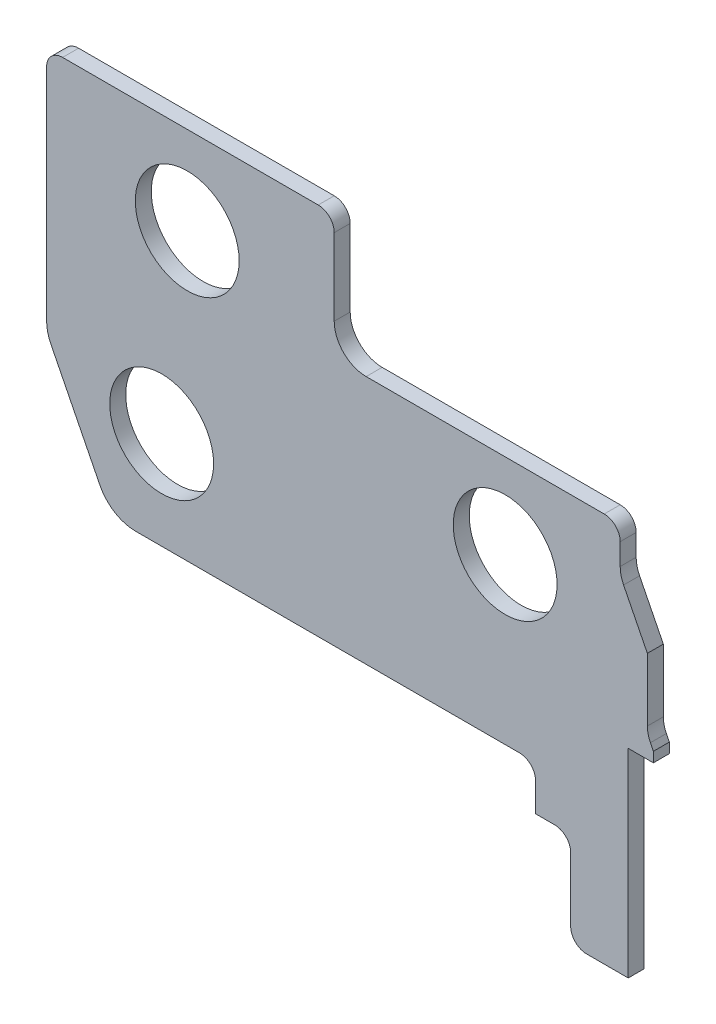
ISO-10303-21;
HEADER;
FILE_DESCRIPTION(('STEP AP214'),'2;1');
FILE_NAME('part.step','',(''),(''),'','','');
FILE_SCHEMA(('AUTOMOTIVE_DESIGN { 1 0 10303 214 1 1 1 1 }'));
ENDSEC;
DATA;
#1=APPLICATION_CONTEXT('core data for automotive mechanical design processes');
#2=APPLICATION_PROTOCOL_DEFINITION('international standard','automotive_design',2000,#1);
#3=PRODUCT_CONTEXT('',#1,'mechanical');
#4=PRODUCT('Part','Part','',(#3));
#5=PRODUCT_RELATED_PRODUCT_CATEGORY('part','',(#4));
#6=PRODUCT_DEFINITION_FORMATION('','',#4);
#7=PRODUCT_DEFINITION_CONTEXT('part definition',#1,'design');
#8=PRODUCT_DEFINITION('design','',#6,#7);
#9=PRODUCT_DEFINITION_SHAPE('','',#8);
#10=(LENGTH_UNIT() NAMED_UNIT(*) SI_UNIT(.MILLI.,.METRE.));
#11=(NAMED_UNIT(*) PLANE_ANGLE_UNIT() SI_UNIT($,.RADIAN.));
#12=(NAMED_UNIT(*) SI_UNIT($,.STERADIAN.) SOLID_ANGLE_UNIT());
#13=UNCERTAINTY_MEASURE_WITH_UNIT(LENGTH_MEASURE(1.E-05),#10,'distance_accuracy_value','');
#14=(GEOMETRIC_REPRESENTATION_CONTEXT(3) GLOBAL_UNCERTAINTY_ASSIGNED_CONTEXT((#13)) GLOBAL_UNIT_ASSIGNED_CONTEXT((#10,
#11,#12)) REPRESENTATION_CONTEXT('',''));
#15=CARTESIAN_POINT('',(0.,0.,0.));
#16=DIRECTION('',(0.,0.,1.));
#17=DIRECTION('',(1.,0.,0.));
#18=AXIS2_PLACEMENT_3D('',#15,#16,#17);
#19=CARTESIAN_POINT('',(-75.7031674369768,240.042852562914,1.));
#20=DIRECTION('',(0.,0.,1.));
#21=DIRECTION('',(1.,0.,0.));
#22=AXIS2_PLACEMENT_3D('',#19,#20,#21);
#23=PLANE('',#22);
#24=CARTESIAN_POINT('',(-86.4031674369768,244.887318465559,1.));
#25=DIRECTION('',(0.,0.,1.));
#26=DIRECTION('',(1.,0.,0.));
#27=AXIS2_PLACEMENT_3D('',#24,#25,#26);
#28=CIRCLE('',#27,3.24999999999999);
#29=CARTESIAN_POINT('',(-83.1531674369768,244.887318465559,1.));
#30=VERTEX_POINT('',#29);
#31=EDGE_CURVE('E587',#30,#30,#28,.T.);
#32=ORIENTED_EDGE('',*,*,#31,.F.);
#33=EDGE_LOOP('',(#32));
#34=FACE_BOUND('',#33,.T.);
#35=CARTESIAN_POINT('',(-75.7031674369768,240.042852562914,1.));
#36=DIRECTION('',(0.,0.,-1.));
#37=DIRECTION('',(1.,0.,0.));
#38=AXIS2_PLACEMENT_3D('',#35,#36,#37);
#39=CIRCLE('',#38,1.8);
#40=CARTESIAN_POINT('',(-77.3116780752747,239.234958060839,1.));
#41=VERTEX_POINT('',#40);
#42=CARTESIAN_POINT('',(-77.5031674369768,240.042852562914,1.));
#43=VERTEX_POINT('',#42);
#44=EDGE_CURVE('E348',#41,#43,#39,.T.);
#45=ORIENTED_EDGE('',*,*,#44,.T.);
#46=DIRECTION('',(0.,1.,0.));
#47=VECTOR('',#46,1.);
#48=CARTESIAN_POINT('',(-77.5031674369768,240.042852562914,1.));
#49=LINE('',#48,#47);
#50=CARTESIAN_POINT('',(-77.5031674369768,243.984122492954,1.));
#51=VERTEX_POINT('',#50);
#52=EDGE_CURVE('E164',#43,#51,#49,.T.);
#53=ORIENTED_EDGE('',*,*,#52,.T.);
#54=DIRECTION('',(-0.448830278930408,0.893617021276594,0.));
#55=VECTOR('',#54,1.);
#56=CARTESIAN_POINT('',(-77.5031674369768,243.984122492954,1.));
#57=LINE('',#56,#55);
#58=CARTESIAN_POINT('',(-78.99040147953,246.945192005053,1.));
#59=VERTEX_POINT('',#58);
#60=EDGE_CURVE('E449',#51,#59,#57,.T.);
#61=ORIENTED_EDGE('',*,*,#60,.T.);
#62=CARTESIAN_POINT('',(-77.2031674369768,247.842852562914,1.));
#63=DIRECTION('',(0.,0.,-1.));
#64=DIRECTION('',(1.,0.,0.));
#65=AXIS2_PLACEMENT_3D('',#62,#63,#64);
#66=CIRCLE('',#65,2.);
#67=CARTESIAN_POINT('',(-79.2031674369768,247.842852562914,1.));
#68=VERTEX_POINT('',#67);
#69=EDGE_CURVE('E469',#59,#68,#66,.T.);
#70=ORIENTED_EDGE('',*,*,#69,.T.);
#71=DIRECTION('',(0.,1.,0.));
#72=VECTOR('',#71,1.);
#73=CARTESIAN_POINT('',(-79.2031674369768,247.842852562914,1.));
#74=LINE('',#73,#72);
#75=CARTESIAN_POINT('',(-79.2031674369768,249.187318465559,1.));
#76=VERTEX_POINT('',#75);
#77=EDGE_CURVE('E465',#68,#76,#74,.T.);
#78=ORIENTED_EDGE('',*,*,#77,.T.);
#79=CARTESIAN_POINT('',(-80.2031674369768,249.187318465559,1.));
#80=DIRECTION('',(0.,0.,1.));
#81=DIRECTION('',(1.,0.,0.));
#82=AXIS2_PLACEMENT_3D('',#79,#80,#81);
#83=CIRCLE('',#82,1.);
#84=CARTESIAN_POINT('',(-80.2031674369768,250.187318465559,1.));
#85=VERTEX_POINT('',#84);
#86=EDGE_CURVE('E468',#76,#85,#83,.T.);
#87=ORIENTED_EDGE('',*,*,#86,.T.);
#88=DIRECTION('',(-1.,0.,0.));
#89=VECTOR('',#88,1.);
#90=CARTESIAN_POINT('',(-80.2031674369768,250.187318465559,1.));
#91=LINE('',#90,#89);
#92=CARTESIAN_POINT('',(-95.1031674369768,250.187318465559,1.));
#93=VERTEX_POINT('',#92);
#94=EDGE_CURVE('E473',#85,#93,#91,.T.);
#95=ORIENTED_EDGE('',*,*,#94,.T.);
#96=CARTESIAN_POINT('',(-95.1031674369768,252.187318465559,1.));
#97=DIRECTION('',(0.,0.,-1.));
#98=DIRECTION('',(1.,0.,0.));
#99=AXIS2_PLACEMENT_3D('',#96,#97,#98);
#100=CIRCLE('',#99,2.);
#101=CARTESIAN_POINT('',(-97.1031674369768,252.187318465559,1.));
#102=VERTEX_POINT('',#101);
#103=EDGE_CURVE('E480',#93,#102,#100,.T.);
#104=ORIENTED_EDGE('',*,*,#103,.T.);
#105=DIRECTION('',(0.,1.,0.));
#106=VECTOR('',#105,1.);
#107=CARTESIAN_POINT('',(-97.1031674369768,252.187318465559,1.));
#108=LINE('',#107,#106);
#109=CARTESIAN_POINT('',(-97.1031674369768,256.987318465559,1.));
#110=VERTEX_POINT('',#109);
#111=EDGE_CURVE('E483',#102,#110,#108,.T.);
#112=ORIENTED_EDGE('',*,*,#111,.T.);
#113=CARTESIAN_POINT('',(-98.1031674369768,256.987318465559,1.));
#114=DIRECTION('',(0.,0.,1.));
#115=DIRECTION('',(1.,0.,0.));
#116=AXIS2_PLACEMENT_3D('',#113,#114,#115);
#117=CIRCLE('',#116,1.);
#118=CARTESIAN_POINT('',(-98.1031674369768,257.987318465559,1.));
#119=VERTEX_POINT('',#118);
#120=EDGE_CURVE('E486',#110,#119,#117,.T.);
#121=ORIENTED_EDGE('',*,*,#120,.T.);
#122=DIRECTION('',(-1.,0.,0.));
#123=VECTOR('',#122,1.);
#124=CARTESIAN_POINT('',(-98.1031674369768,257.987318465559,1.));
#125=LINE('',#124,#123);
#126=CARTESIAN_POINT('',(-114.103167436977,257.987318465559,1.));
#127=VERTEX_POINT('',#126);
#128=EDGE_CURVE('E489',#119,#127,#125,.T.);
#129=ORIENTED_EDGE('',*,*,#128,.T.);
#130=CARTESIAN_POINT('',(-114.103167436977,256.987318465559,1.));
#131=DIRECTION('',(0.,0.,1.));
#132=DIRECTION('',(1.,0.,0.));
#133=AXIS2_PLACEMENT_3D('',#130,#131,#132);
#134=CIRCLE('',#133,1.);
#135=CARTESIAN_POINT('',(-115.103167436977,256.987318465559,1.));
#136=VERTEX_POINT('',#135);
#137=EDGE_CURVE('E492',#127,#136,#134,.T.);
#138=ORIENTED_EDGE('',*,*,#137,.T.);
#139=DIRECTION('',(0.,-1.,0.));
#140=VECTOR('',#139,1.);
#141=CARTESIAN_POINT('',(-115.103167436977,256.987318465559,1.));
#142=LINE('',#141,#140);
#143=CARTESIAN_POINT('',(-115.103167436977,243.198386660269,1.));
#144=VERTEX_POINT('',#143);
#145=EDGE_CURVE('E495',#136,#144,#142,.T.);
#146=ORIENTED_EDGE('',*,*,#145,.T.);
#147=CARTESIAN_POINT('',(-112.603167436977,243.198386660269,1.));
#148=DIRECTION('',(0.,0.,1.));
#149=DIRECTION('',(1.,0.,0.));
#150=AXIS2_PLACEMENT_3D('',#147,#148,#149);
#151=CIRCLE('',#150,2.5);
#152=CARTESIAN_POINT('',(-114.837209990168,242.076310962943,1.));
#153=VERTEX_POINT('',#152);
#154=EDGE_CURVE('E498',#144,#153,#151,.T.);
#155=ORIENTED_EDGE('',*,*,#154,.T.);
#156=DIRECTION('',(0.448830278930403,-0.893617021276596,0.));
#157=VECTOR('',#156,1.);
#158=CARTESIAN_POINT('',(-114.837209990168,242.076310962943,1.));
#159=LINE('',#158,#157);
#160=CARTESIAN_POINT('',(-111.76784987606,235.965242768233,1.));
#161=VERTEX_POINT('',#160);
#162=EDGE_CURVE('E501',#153,#161,#159,.T.);
#163=ORIENTED_EDGE('',*,*,#162,.T.);
#164=CARTESIAN_POINT('',(-109.533807322869,237.087318465559,1.));
#165=DIRECTION('',(0.,0.,1.));
#166=DIRECTION('',(1.,0.,0.));
#167=AXIS2_PLACEMENT_3D('',#164,#165,#166);
#168=CIRCLE('',#167,2.5);
#169=CARTESIAN_POINT('',(-109.533807322869,234.587318465559,1.));
#170=VERTEX_POINT('',#169);
#171=EDGE_CURVE('E504',#161,#170,#168,.T.);
#172=ORIENTED_EDGE('',*,*,#171,.T.);
#173=DIRECTION('',(1.,0.,0.));
#174=VECTOR('',#173,1.);
#175=CARTESIAN_POINT('',(-109.533807322869,234.587318465559,1.));
#176=LINE('',#175,#174);
#177=CARTESIAN_POINT('',(-85.5031674369768,234.587318465559,1.));
#178=VERTEX_POINT('',#177);
#179=EDGE_CURVE('E507',#170,#178,#176,.T.);
#180=ORIENTED_EDGE('',*,*,#179,.T.);
#181=CARTESIAN_POINT('',(-85.5031674369768,233.587318465559,1.));
#182=DIRECTION('',(0.,0.,-1.));
#183=DIRECTION('',(1.,0.,0.));
#184=AXIS2_PLACEMENT_3D('',#181,#182,#183);
#185=CIRCLE('',#184,1.);
#186=CARTESIAN_POINT('',(-84.5031674369768,233.587318465559,1.));
#187=VERTEX_POINT('',#186);
#188=EDGE_CURVE('E510',#178,#187,#185,.T.);
#189=ORIENTED_EDGE('',*,*,#188,.T.);
#190=DIRECTION('',(0.,-1.,0.));
#191=VECTOR('',#190,1.);
#192=CARTESIAN_POINT('',(-84.5031674369768,233.587318465559,1.));
#193=LINE('',#192,#191);
#194=CARTESIAN_POINT('',(-84.5031674369768,231.787318465559,1.));
#195=VERTEX_POINT('',#194);
#196=EDGE_CURVE('E513',#187,#195,#193,.T.);
#197=ORIENTED_EDGE('',*,*,#196,.T.);
#198=DIRECTION('',(1.,0.,0.));
#199=VECTOR('',#198,1.);
#200=CARTESIAN_POINT('',(-84.5031674369768,231.787318465559,1.));
#201=LINE('',#200,#199);
#202=CARTESIAN_POINT('',(-83.3031674369768,231.787318465559,1.));
#203=VERTEX_POINT('',#202);
#204=EDGE_CURVE('E516',#195,#203,#201,.T.);
#205=ORIENTED_EDGE('',*,*,#204,.T.);
#206=CARTESIAN_POINT('',(-83.3031674369768,230.787318465559,1.));
#207=DIRECTION('',(0.,0.,-1.));
#208=DIRECTION('',(1.,0.,0.));
#209=AXIS2_PLACEMENT_3D('',#206,#207,#208);
#210=CIRCLE('',#209,1.);
#211=CARTESIAN_POINT('',(-82.3031674369768,230.787318465559,1.));
#212=VERTEX_POINT('',#211);
#213=EDGE_CURVE('E519',#203,#212,#210,.T.);
#214=ORIENTED_EDGE('',*,*,#213,.T.);
#215=DIRECTION('',(0.,-1.,0.));
#216=VECTOR('',#215,1.);
#217=CARTESIAN_POINT('',(-82.3031674369768,230.787318465559,1.));
#218=LINE('',#217,#216);
#219=CARTESIAN_POINT('',(-82.3031674369768,226.787318465559,1.));
#220=VERTEX_POINT('',#219);
#221=EDGE_CURVE('E522',#212,#220,#218,.T.);
#222=ORIENTED_EDGE('',*,*,#221,.T.);
#223=CARTESIAN_POINT('',(-81.3031674369768,226.787318465559,1.));
#224=DIRECTION('',(0.,0.,1.));
#225=DIRECTION('',(1.,0.,0.));
#226=AXIS2_PLACEMENT_3D('',#223,#224,#225);
#227=CIRCLE('',#226,1.);
#228=CARTESIAN_POINT('',(-81.3031674369768,225.787318465559,1.));
#229=VERTEX_POINT('',#228);
#230=EDGE_CURVE('E525',#220,#229,#227,.T.);
#231=ORIENTED_EDGE('',*,*,#230,.T.);
#232=DIRECTION('',(1.,0.,0.));
#233=VECTOR('',#232,1.);
#234=CARTESIAN_POINT('',(-81.3031674369768,225.787318465559,1.));
#235=LINE('',#234,#233);
#236=CARTESIAN_POINT('',(-78.6999999999858,225.787318465559,1.));
#237=VERTEX_POINT('',#236);
#238=EDGE_CURVE('E528',#229,#237,#235,.T.);
#239=ORIENTED_EDGE('',*,*,#238,.T.);
#240=DIRECTION('',(0.,1.,0.));
#241=VECTOR('',#240,1.);
#242=CARTESIAN_POINT('',(-78.6999999999858,225.787318465559,1.));
#243=LINE('',#242,#241);
#244=CARTESIAN_POINT('',(-78.6999999999858,238.236297681887,1.));
#245=VERTEX_POINT('',#244);
#246=EDGE_CURVE('E243',#237,#245,#243,.T.);
#247=ORIENTED_EDGE('',*,*,#246,.T.);
#248=DIRECTION('',(1.,0.,0.));
#249=VECTOR('',#248,1.);
#250=CARTESIAN_POINT('',(-78.6999999999858,238.236297681887,1.));
#251=LINE('',#250,#249);
#252=CARTESIAN_POINT('',(-77.1252272914991,238.236297681887,1.));
#253=VERTEX_POINT('',#252);
#254=EDGE_CURVE('E237',#245,#253,#251,.T.);
#255=ORIENTED_EDGE('',*,*,#254,.T.);
#256=DIRECTION('',(0.,1.,0.));
#257=VECTOR('',#256,1.);
#258=CARTESIAN_POINT('',(-77.1252272914991,238.236297681887,1.));
#259=LINE('',#258,#257);
#260=CARTESIAN_POINT('',(-77.1252272914991,238.863736238619,1.));
#261=VERTEX_POINT('',#260);
#262=EDGE_CURVE('E241',#253,#261,#259,.T.);
#263=ORIENTED_EDGE('',*,*,#262,.T.);
#264=DIRECTION('',(-0.448830278930413,0.893617021276591,0.));
#265=VECTOR('',#264,1.);
#266=CARTESIAN_POINT('',(-77.1252272914991,238.863736238619,1.));
#267=LINE('',#266,#265);
#268=EDGE_CURVE('E61',#261,#41,#267,.T.);
#269=ORIENTED_EDGE('',*,*,#268,.T.);
#270=EDGE_LOOP('',(#45,#53,#61,#70,#78,#87,#95,#104,#112,#121,#129,#138,#146,#155,#163,#172,
#180,#189,#197,#205,#214,#222,#231,#239,#247,#255,#263,#269));
#271=FACE_BOUND('',#270,.T.);
#272=CARTESIAN_POINT('',(-107.903167436977,240.687318465559,1.));
#273=DIRECTION('',(0.,0.,1.));
#274=DIRECTION('',(1.,0.,0.));
#275=AXIS2_PLACEMENT_3D('',#272,#273,#274);
#276=CIRCLE('',#275,3.25000000000001);
#277=CARTESIAN_POINT('',(-104.653167436977,240.687318465559,1.));
#278=VERTEX_POINT('',#277);
#279=EDGE_CURVE('E270',#278,#278,#276,.T.);
#280=ORIENTED_EDGE('',*,*,#279,.F.);
#281=EDGE_LOOP('',(#280));
#282=FACE_BOUND('',#281,.T.);
#283=CARTESIAN_POINT('',(-106.303167436977,252.487318465559,1.));
#284=DIRECTION('',(0.,0.,1.));
#285=DIRECTION('',(1.,0.,0.));
#286=AXIS2_PLACEMENT_3D('',#283,#284,#285);
#287=CIRCLE('',#286,3.24999999999999);
#288=CARTESIAN_POINT('',(-103.053167436977,252.487318465559,1.));
#289=VERTEX_POINT('',#288);
#290=EDGE_CURVE('E576',#289,#289,#287,.T.);
#291=ORIENTED_EDGE('',*,*,#290,.F.);
#292=EDGE_LOOP('',(#291));
#293=FACE_BOUND('',#292,.T.);
#294=ADVANCED_FACE('F43',(#34,#271,#282,#293),#23,.T.);
#295=CARTESIAN_POINT('',(-75.7031674369768,240.042852562914,0.));
#296=DIRECTION('',(0.,0.,1.));
#297=DIRECTION('',(1.,0.,0.));
#298=AXIS2_PLACEMENT_3D('',#295,#296,#297);
#299=PLANE('',#298);
#300=CARTESIAN_POINT('',(-75.7031674369768,240.042852562914,0.));
#301=DIRECTION('',(0.,0.,-1.));
#302=DIRECTION('',(1.,0.,0.));
#303=AXIS2_PLACEMENT_3D('',#300,#301,#302);
#304=CIRCLE('',#303,1.8);
#305=CARTESIAN_POINT('',(-77.3116780752747,239.234958060839,0.));
#306=VERTEX_POINT('',#305);
#307=CARTESIAN_POINT('',(-77.5031674369768,240.042852562914,0.));
#308=VERTEX_POINT('',#307);
#309=EDGE_CURVE('E265',#306,#308,#304,.T.);
#310=ORIENTED_EDGE('',*,*,#309,.F.);
#311=DIRECTION('',(-0.448830278930413,0.893617021276591,0.));
#312=VECTOR('',#311,1.);
#313=CARTESIAN_POINT('',(-77.1252272914991,238.863736238619,0.));
#314=LINE('',#313,#312);
#315=CARTESIAN_POINT('',(-77.1252272914991,238.863736238619,0.));
#316=VERTEX_POINT('',#315);
#317=EDGE_CURVE('E156',#316,#306,#314,.T.);
#318=ORIENTED_EDGE('',*,*,#317,.F.);
#319=DIRECTION('',(0.,1.,0.));
#320=VECTOR('',#319,1.);
#321=CARTESIAN_POINT('',(-77.1252272914991,238.236297681887,0.));
#322=LINE('',#321,#320);
#323=CARTESIAN_POINT('',(-77.1252272914991,238.236297681887,0.));
#324=VERTEX_POINT('',#323);
#325=EDGE_CURVE('E150',#324,#316,#322,.T.);
#326=ORIENTED_EDGE('',*,*,#325,.F.);
#327=DIRECTION('',(1.,0.,0.));
#328=VECTOR('',#327,1.);
#329=CARTESIAN_POINT('',(-78.6999999999858,238.236297681887,0.));
#330=LINE('',#329,#328);
#331=CARTESIAN_POINT('',(-78.6999999999858,238.236297681887,0.));
#332=VERTEX_POINT('',#331);
#333=EDGE_CURVE('E252',#332,#324,#330,.T.);
#334=ORIENTED_EDGE('',*,*,#333,.F.);
#335=DIRECTION('',(0.,1.,0.));
#336=VECTOR('',#335,1.);
#337=CARTESIAN_POINT('',(-78.6999999999858,225.787318465559,0.));
#338=LINE('',#337,#336);
#339=CARTESIAN_POINT('',(-78.6999999999858,225.787318465559,0.));
#340=VERTEX_POINT('',#339);
#341=EDGE_CURVE('E339',#340,#332,#338,.T.);
#342=ORIENTED_EDGE('',*,*,#341,.F.);
#343=DIRECTION('',(1.,0.,0.));
#344=VECTOR('',#343,1.);
#345=CARTESIAN_POINT('',(-81.3031674369768,225.787318465559,0.));
#346=LINE('',#345,#344);
#347=CARTESIAN_POINT('',(-81.3031674369768,225.787318465559,0.));
#348=VERTEX_POINT('',#347);
#349=EDGE_CURVE('E336',#348,#340,#346,.T.);
#350=ORIENTED_EDGE('',*,*,#349,.F.);
#351=CARTESIAN_POINT('',(-81.3031674369768,226.787318465559,0.));
#352=DIRECTION('',(0.,0.,1.));
#353=DIRECTION('',(1.,0.,0.));
#354=AXIS2_PLACEMENT_3D('',#351,#352,#353);
#355=CIRCLE('',#354,1.);
#356=CARTESIAN_POINT('',(-82.3031674369768,226.787318465559,0.));
#357=VERTEX_POINT('',#356);
#358=EDGE_CURVE('E333',#357,#348,#355,.T.);
#359=ORIENTED_EDGE('',*,*,#358,.F.);
#360=DIRECTION('',(0.,-1.,0.));
#361=VECTOR('',#360,1.);
#362=CARTESIAN_POINT('',(-82.3031674369768,230.787318465559,0.));
#363=LINE('',#362,#361);
#364=CARTESIAN_POINT('',(-82.3031674369768,230.787318465559,0.));
#365=VERTEX_POINT('',#364);
#366=EDGE_CURVE('E330',#365,#357,#363,.T.);
#367=ORIENTED_EDGE('',*,*,#366,.F.);
#368=CARTESIAN_POINT('',(-83.3031674369768,230.787318465559,0.));
#369=DIRECTION('',(0.,0.,-1.));
#370=DIRECTION('',(1.,0.,0.));
#371=AXIS2_PLACEMENT_3D('',#368,#369,#370);
#372=CIRCLE('',#371,1.);
#373=CARTESIAN_POINT('',(-83.3031674369768,231.787318465559,0.));
#374=VERTEX_POINT('',#373);
#375=EDGE_CURVE('E327',#374,#365,#372,.T.);
#376=ORIENTED_EDGE('',*,*,#375,.F.);
#377=DIRECTION('',(1.,0.,0.));
#378=VECTOR('',#377,1.);
#379=CARTESIAN_POINT('',(-84.5031674369768,231.787318465559,0.));
#380=LINE('',#379,#378);
#381=CARTESIAN_POINT('',(-84.5031674369768,231.787318465559,0.));
#382=VERTEX_POINT('',#381);
#383=EDGE_CURVE('E324',#382,#374,#380,.T.);
#384=ORIENTED_EDGE('',*,*,#383,.F.);
#385=DIRECTION('',(0.,-1.,0.));
#386=VECTOR('',#385,1.);
#387=CARTESIAN_POINT('',(-84.5031674369768,233.587318465559,0.));
#388=LINE('',#387,#386);
#389=CARTESIAN_POINT('',(-84.5031674369768,233.587318465559,0.));
#390=VERTEX_POINT('',#389);
#391=EDGE_CURVE('E321',#390,#382,#388,.T.);
#392=ORIENTED_EDGE('',*,*,#391,.F.);
#393=CARTESIAN_POINT('',(-85.5031674369768,233.587318465559,0.));
#394=DIRECTION('',(0.,0.,-1.));
#395=DIRECTION('',(1.,0.,0.));
#396=AXIS2_PLACEMENT_3D('',#393,#394,#395);
#397=CIRCLE('',#396,1.);
#398=CARTESIAN_POINT('',(-85.5031674369768,234.587318465559,0.));
#399=VERTEX_POINT('',#398);
#400=EDGE_CURVE('E318',#399,#390,#397,.T.);
#401=ORIENTED_EDGE('',*,*,#400,.F.);
#402=DIRECTION('',(1.,0.,0.));
#403=VECTOR('',#402,1.);
#404=CARTESIAN_POINT('',(-109.533807322869,234.587318465559,0.));
#405=LINE('',#404,#403);
#406=CARTESIAN_POINT('',(-109.533807322869,234.587318465559,0.));
#407=VERTEX_POINT('',#406);
#408=EDGE_CURVE('E315',#407,#399,#405,.T.);
#409=ORIENTED_EDGE('',*,*,#408,.F.);
#410=CARTESIAN_POINT('',(-109.533807322869,237.087318465559,0.));
#411=DIRECTION('',(0.,0.,1.));
#412=DIRECTION('',(1.,0.,0.));
#413=AXIS2_PLACEMENT_3D('',#410,#411,#412);
#414=CIRCLE('',#413,2.5);
#415=CARTESIAN_POINT('',(-111.76784987606,235.965242768233,0.));
#416=VERTEX_POINT('',#415);
#417=EDGE_CURVE('E312',#416,#407,#414,.T.);
#418=ORIENTED_EDGE('',*,*,#417,.F.);
#419=DIRECTION('',(0.448830278930403,-0.893617021276596,0.));
#420=VECTOR('',#419,1.);
#421=CARTESIAN_POINT('',(-114.837209990168,242.076310962943,0.));
#422=LINE('',#421,#420);
#423=CARTESIAN_POINT('',(-114.837209990168,242.076310962943,0.));
#424=VERTEX_POINT('',#423);
#425=EDGE_CURVE('E309',#424,#416,#422,.T.);
#426=ORIENTED_EDGE('',*,*,#425,.F.);
#427=CARTESIAN_POINT('',(-112.603167436977,243.198386660269,0.));
#428=DIRECTION('',(0.,0.,1.));
#429=DIRECTION('',(1.,0.,0.));
#430=AXIS2_PLACEMENT_3D('',#427,#428,#429);
#431=CIRCLE('',#430,2.5);
#432=CARTESIAN_POINT('',(-115.103167436977,243.198386660269,0.));
#433=VERTEX_POINT('',#432);
#434=EDGE_CURVE('E306',#433,#424,#431,.T.);
#435=ORIENTED_EDGE('',*,*,#434,.F.);
#436=DIRECTION('',(0.,-1.,0.));
#437=VECTOR('',#436,1.);
#438=CARTESIAN_POINT('',(-115.103167436977,256.987318465559,0.));
#439=LINE('',#438,#437);
#440=CARTESIAN_POINT('',(-115.103167436977,256.987318465559,0.));
#441=VERTEX_POINT('',#440);
#442=EDGE_CURVE('E303',#441,#433,#439,.T.);
#443=ORIENTED_EDGE('',*,*,#442,.F.);
#444=CARTESIAN_POINT('',(-114.103167436977,256.987318465559,0.));
#445=DIRECTION('',(0.,0.,1.));
#446=DIRECTION('',(1.,0.,0.));
#447=AXIS2_PLACEMENT_3D('',#444,#445,#446);
#448=CIRCLE('',#447,1.);
#449=CARTESIAN_POINT('',(-114.103167436977,257.987318465559,0.));
#450=VERTEX_POINT('',#449);
#451=EDGE_CURVE('E300',#450,#441,#448,.T.);
#452=ORIENTED_EDGE('',*,*,#451,.F.);
#453=DIRECTION('',(-1.,0.,0.));
#454=VECTOR('',#453,1.);
#455=CARTESIAN_POINT('',(-98.1031674369768,257.987318465559,0.));
#456=LINE('',#455,#454);
#457=CARTESIAN_POINT('',(-98.1031674369768,257.987318465559,0.));
#458=VERTEX_POINT('',#457);
#459=EDGE_CURVE('E297',#458,#450,#456,.T.);
#460=ORIENTED_EDGE('',*,*,#459,.F.);
#461=CARTESIAN_POINT('',(-98.1031674369768,256.987318465559,0.));
#462=DIRECTION('',(0.,0.,1.));
#463=DIRECTION('',(1.,0.,0.));
#464=AXIS2_PLACEMENT_3D('',#461,#462,#463);
#465=CIRCLE('',#464,1.);
#466=CARTESIAN_POINT('',(-97.1031674369768,256.987318465559,0.));
#467=VERTEX_POINT('',#466);
#468=EDGE_CURVE('E294',#467,#458,#465,.T.);
#469=ORIENTED_EDGE('',*,*,#468,.F.);
#470=DIRECTION('',(0.,1.,0.));
#471=VECTOR('',#470,1.);
#472=CARTESIAN_POINT('',(-97.1031674369768,252.187318465559,0.));
#473=LINE('',#472,#471);
#474=CARTESIAN_POINT('',(-97.1031674369768,252.187318465559,0.));
#475=VERTEX_POINT('',#474);
#476=EDGE_CURVE('E291',#475,#467,#473,.T.);
#477=ORIENTED_EDGE('',*,*,#476,.F.);
#478=CARTESIAN_POINT('',(-95.1031674369768,252.187318465559,0.));
#479=DIRECTION('',(0.,0.,-1.));
#480=DIRECTION('',(1.,0.,0.));
#481=AXIS2_PLACEMENT_3D('',#478,#479,#480);
#482=CIRCLE('',#481,2.);
#483=CARTESIAN_POINT('',(-95.1031674369768,250.187318465559,0.));
#484=VERTEX_POINT('',#483);
#485=EDGE_CURVE('E288',#484,#475,#482,.T.);
#486=ORIENTED_EDGE('',*,*,#485,.F.);
#487=DIRECTION('',(-1.,0.,0.));
#488=VECTOR('',#487,1.);
#489=CARTESIAN_POINT('',(-80.2031674369768,250.187318465559,0.));
#490=LINE('',#489,#488);
#491=CARTESIAN_POINT('',(-80.2031674369768,250.187318465559,0.));
#492=VERTEX_POINT('',#491);
#493=EDGE_CURVE('E285',#492,#484,#490,.T.);
#494=ORIENTED_EDGE('',*,*,#493,.F.);
#495=CARTESIAN_POINT('',(-80.2031674369768,249.187318465559,0.));
#496=DIRECTION('',(0.,0.,1.));
#497=DIRECTION('',(1.,0.,0.));
#498=AXIS2_PLACEMENT_3D('',#495,#496,#497);
#499=CIRCLE('',#498,1.);
#500=CARTESIAN_POINT('',(-79.2031674369768,249.187318465559,0.));
#501=VERTEX_POINT('',#500);
#502=EDGE_CURVE('E282',#501,#492,#499,.T.);
#503=ORIENTED_EDGE('',*,*,#502,.F.);
#504=DIRECTION('',(0.,1.,0.));
#505=VECTOR('',#504,1.);
#506=CARTESIAN_POINT('',(-79.2031674369768,247.842852562914,0.));
#507=LINE('',#506,#505);
#508=CARTESIAN_POINT('',(-79.2031674369768,247.842852562914,0.));
#509=VERTEX_POINT('',#508);
#510=EDGE_CURVE('E279',#509,#501,#507,.T.);
#511=ORIENTED_EDGE('',*,*,#510,.F.);
#512=CARTESIAN_POINT('',(-77.2031674369768,247.842852562914,0.));
#513=DIRECTION('',(0.,0.,-1.));
#514=DIRECTION('',(1.,0.,0.));
#515=AXIS2_PLACEMENT_3D('',#512,#513,#514);
#516=CIRCLE('',#515,2.);
#517=CARTESIAN_POINT('',(-78.99040147953,246.945192005053,0.));
#518=VERTEX_POINT('',#517);
#519=EDGE_CURVE('E276',#518,#509,#516,.T.);
#520=ORIENTED_EDGE('',*,*,#519,.F.);
#521=DIRECTION('',(-0.448830278930408,0.893617021276594,0.));
#522=VECTOR('',#521,1.);
#523=CARTESIAN_POINT('',(-77.5031674369768,243.984122492954,0.));
#524=LINE('',#523,#522);
#525=CARTESIAN_POINT('',(-77.5031674369768,243.984122492954,0.));
#526=VERTEX_POINT('',#525);
#527=EDGE_CURVE('E273',#526,#518,#524,.T.);
#528=ORIENTED_EDGE('',*,*,#527,.F.);
#529=DIRECTION('',(0.,1.,0.));
#530=VECTOR('',#529,1.);
#531=CARTESIAN_POINT('',(-77.5031674369768,240.042852562914,0.));
#532=LINE('',#531,#530);
#533=EDGE_CURVE('E269',#308,#526,#532,.T.);
#534=ORIENTED_EDGE('',*,*,#533,.F.);
#535=EDGE_LOOP('',(#310,#318,#326,#334,#342,#350,#359,#367,#376,#384,#392,#401,#409,#418,#426,
#435,#443,#452,#460,#469,#477,#486,#494,#503,#511,#520,#528,#534));
#536=FACE_BOUND('',#535,.T.);
#537=CARTESIAN_POINT('',(-107.903167436977,240.687318465559,0.));
#538=DIRECTION('',(0.,0.,1.));
#539=DIRECTION('',(1.,0.,0.));
#540=AXIS2_PLACEMENT_3D('',#537,#538,#539);
#541=CIRCLE('',#540,3.25000000000001);
#542=CARTESIAN_POINT('',(-104.653167436977,240.687318465559,0.));
#543=VERTEX_POINT('',#542);
#544=EDGE_CURVE('E591',#543,#543,#541,.T.);
#545=ORIENTED_EDGE('',*,*,#544,.T.);
#546=EDGE_LOOP('',(#545));
#547=FACE_BOUND('',#546,.T.);
#548=CARTESIAN_POINT('',(-86.4031674369768,244.887318465559,0.));
#549=DIRECTION('',(0.,0.,1.));
#550=DIRECTION('',(1.,0.,0.));
#551=AXIS2_PLACEMENT_3D('',#548,#549,#550);
#552=CIRCLE('',#551,3.24999999999999);
#553=CARTESIAN_POINT('',(-83.1531674369768,244.887318465559,0.));
#554=VERTEX_POINT('',#553);
#555=EDGE_CURVE('E584',#554,#554,#552,.T.);
#556=ORIENTED_EDGE('',*,*,#555,.T.);
#557=EDGE_LOOP('',(#556));
#558=FACE_BOUND('',#557,.T.);
#559=CARTESIAN_POINT('',(-106.303167436977,252.487318465559,0.));
#560=DIRECTION('',(0.,0.,1.));
#561=DIRECTION('',(1.,0.,0.));
#562=AXIS2_PLACEMENT_3D('',#559,#560,#561);
#563=CIRCLE('',#562,3.24999999999999);
#564=CARTESIAN_POINT('',(-103.053167436977,252.487318465559,0.));
#565=VERTEX_POINT('',#564);
#566=EDGE_CURVE('E579',#565,#565,#563,.T.);
#567=ORIENTED_EDGE('',*,*,#566,.T.);
#568=EDGE_LOOP('',(#567));
#569=FACE_BOUND('',#568,.T.);
#570=ADVANCED_FACE('F453',(#536,#547,#558,#569),#299,.F.);
#571=CARTESIAN_POINT('',(-75.7031674369768,240.042852562914,1.));
#572=DIRECTION('',(0.,0.,-1.));
#573=DIRECTION('',(-1.,0.,0.));
#574=AXIS2_PLACEMENT_3D('',#571,#572,#573);
#575=CYLINDRICAL_SURFACE('',#574,1.8);
#576=ORIENTED_EDGE('',*,*,#309,.T.);
#577=DIRECTION('',(0.,0.,-1.));
#578=VECTOR('',#577,1.);
#579=CARTESIAN_POINT('',(-77.5031674369768,240.042852562914,1.));
#580=LINE('',#579,#578);
#581=EDGE_CURVE('E11',#43,#308,#580,.T.);
#582=ORIENTED_EDGE('',*,*,#581,.F.);
#583=ORIENTED_EDGE('',*,*,#44,.F.);
#584=DIRECTION('',(0.,0.,-1.));
#585=VECTOR('',#584,1.);
#586=CARTESIAN_POINT('',(-77.3116780752747,239.234958060839,1.));
#587=LINE('',#586,#585);
#588=EDGE_CURVE('E261',#41,#306,#587,.T.);
#589=ORIENTED_EDGE('',*,*,#588,.T.);
#590=EDGE_LOOP('',(#576,#582,#583,#589));
#591=FACE_BOUND('',#590,.T.);
#592=ADVANCED_FACE('F45',(#591),#575,.F.);
#593=CARTESIAN_POINT('',(-77.5031674369768,240.042852562914,1.));
#594=DIRECTION('',(-1.,0.,0.));
#595=DIRECTION('',(0.,0.,1.));
#596=AXIS2_PLACEMENT_3D('',#593,#594,#595);
#597=PLANE('',#596);
#598=ORIENTED_EDGE('',*,*,#533,.T.);
#599=DIRECTION('',(0.,0.,-1.));
#600=VECTOR('',#599,1.);
#601=CARTESIAN_POINT('',(-77.5031674369768,243.984122492954,1.));
#602=LINE('',#601,#600);
#603=EDGE_CURVE('E53',#51,#526,#602,.T.);
#604=ORIENTED_EDGE('',*,*,#603,.F.);
#605=ORIENTED_EDGE('',*,*,#52,.F.);
#606=ORIENTED_EDGE('',*,*,#581,.T.);
#607=EDGE_LOOP('',(#598,#604,#605,#606));
#608=FACE_BOUND('',#607,.T.);
#609=ADVANCED_FACE('F885',(#608),#597,.F.);
#610=CARTESIAN_POINT('',(-77.5031674369768,243.984122492954,1.));
#611=DIRECTION('',(-0.893617021276594,-0.448830278930408,0.));
#612=DIRECTION('',(0.448830278930408,-0.893617021276594,0.));
#613=AXIS2_PLACEMENT_3D('',#610,#611,#612);
#614=PLANE('',#613);
#615=ORIENTED_EDGE('',*,*,#527,.T.);
#616=DIRECTION('',(0.,0.,-1.));
#617=VECTOR('',#616,1.);
#618=CARTESIAN_POINT('',(-78.99040147953,246.945192005053,1.));
#619=LINE('',#618,#617);
#620=EDGE_CURVE('E439',#59,#518,#619,.T.);
#621=ORIENTED_EDGE('',*,*,#620,.F.);
#622=ORIENTED_EDGE('',*,*,#60,.F.);
#623=ORIENTED_EDGE('',*,*,#603,.T.);
#624=EDGE_LOOP('',(#615,#621,#622,#623));
#625=FACE_BOUND('',#624,.T.);
#626=ADVANCED_FACE('F447',(#625),#614,.F.);
#627=CARTESIAN_POINT('',(-77.2031674369768,247.842852562914,1.));
#628=DIRECTION('',(0.,0.,-1.));
#629=DIRECTION('',(-1.,0.,0.));
#630=AXIS2_PLACEMENT_3D('',#627,#628,#629);
#631=CYLINDRICAL_SURFACE('',#630,2.);
#632=ORIENTED_EDGE('',*,*,#519,.T.);
#633=DIRECTION('',(0.,0.,-1.));
#634=VECTOR('',#633,1.);
#635=CARTESIAN_POINT('',(-79.2031674369768,247.842852562914,1.));
#636=LINE('',#635,#634);
#637=EDGE_CURVE('E435',#68,#509,#636,.T.);
#638=ORIENTED_EDGE('',*,*,#637,.F.);
#639=ORIENTED_EDGE('',*,*,#69,.F.);
#640=ORIENTED_EDGE('',*,*,#620,.T.);
#641=EDGE_LOOP('',(#632,#638,#639,#640));
#642=FACE_BOUND('',#641,.T.);
#643=ADVANCED_FACE('F459',(#642),#631,.F.);
#644=CARTESIAN_POINT('',(-79.2031674369768,247.842852562914,1.));
#645=DIRECTION('',(-1.,0.,0.));
#646=DIRECTION('',(0.,0.,1.));
#647=AXIS2_PLACEMENT_3D('',#644,#645,#646);
#648=PLANE('',#647);
#649=ORIENTED_EDGE('',*,*,#510,.T.);
#650=DIRECTION('',(0.,0.,-1.));
#651=VECTOR('',#650,1.);
#652=CARTESIAN_POINT('',(-79.2031674369768,249.187318465559,1.));
#653=LINE('',#652,#651);
#654=EDGE_CURVE('E431',#76,#501,#653,.T.);
#655=ORIENTED_EDGE('',*,*,#654,.F.);
#656=ORIENTED_EDGE('',*,*,#77,.F.);
#657=ORIENTED_EDGE('',*,*,#637,.T.);
#658=EDGE_LOOP('',(#649,#655,#656,#657));
#659=FACE_BOUND('',#658,.T.);
#660=ADVANCED_FACE('F463',(#659),#648,.F.);
#661=CARTESIAN_POINT('',(-80.2031674369768,249.187318465559,1.));
#662=DIRECTION('',(0.,0.,-1.));
#663=DIRECTION('',(-1.,0.,0.));
#664=AXIS2_PLACEMENT_3D('',#661,#662,#663);
#665=CYLINDRICAL_SURFACE('',#664,1.);
#666=ORIENTED_EDGE('',*,*,#502,.T.);
#667=DIRECTION('',(0.,0.,-1.));
#668=VECTOR('',#667,1.);
#669=CARTESIAN_POINT('',(-80.2031674369768,250.187318465559,1.));
#670=LINE('',#669,#668);
#671=EDGE_CURVE('E427',#85,#492,#670,.T.);
#672=ORIENTED_EDGE('',*,*,#671,.F.);
#673=ORIENTED_EDGE('',*,*,#86,.F.);
#674=ORIENTED_EDGE('',*,*,#654,.T.);
#675=EDGE_LOOP('',(#666,#672,#673,#674));
#676=FACE_BOUND('',#675,.T.);
#677=ADVANCED_FACE('F846',(#676),#665,.T.);
#678=CARTESIAN_POINT('',(-80.2031674369768,250.187318465559,1.));
#679=DIRECTION('',(0.,-1.,0.));
#680=DIRECTION('',(0.,0.,-1.));
#681=AXIS2_PLACEMENT_3D('',#678,#679,#680);
#682=PLANE('',#681);
#683=ORIENTED_EDGE('',*,*,#493,.T.);
#684=DIRECTION('',(0.,0.,-1.));
#685=VECTOR('',#684,1.);
#686=CARTESIAN_POINT('',(-95.1031674369768,250.187318465559,1.));
#687=LINE('',#686,#685);
#688=EDGE_CURVE('E423',#93,#484,#687,.T.);
#689=ORIENTED_EDGE('',*,*,#688,.F.);
#690=ORIENTED_EDGE('',*,*,#94,.F.);
#691=ORIENTED_EDGE('',*,*,#671,.T.);
#692=EDGE_LOOP('',(#683,#689,#690,#691));
#693=FACE_BOUND('',#692,.T.);
#694=ADVANCED_FACE('F835',(#693),#682,.F.);
#695=CARTESIAN_POINT('',(-95.1031674369768,252.187318465559,1.));
#696=DIRECTION('',(0.,0.,-1.));
#697=DIRECTION('',(-1.,0.,0.));
#698=AXIS2_PLACEMENT_3D('',#695,#696,#697);
#699=CYLINDRICAL_SURFACE('',#698,2.);
#700=ORIENTED_EDGE('',*,*,#485,.T.);
#701=DIRECTION('',(0.,0.,-1.));
#702=VECTOR('',#701,1.);
#703=CARTESIAN_POINT('',(-97.1031674369768,252.187318465559,1.));
#704=LINE('',#703,#702);
#705=EDGE_CURVE('E419',#102,#475,#704,.T.);
#706=ORIENTED_EDGE('',*,*,#705,.F.);
#707=ORIENTED_EDGE('',*,*,#103,.F.);
#708=ORIENTED_EDGE('',*,*,#688,.T.);
#709=EDGE_LOOP('',(#700,#706,#707,#708));
#710=FACE_BOUND('',#709,.T.);
#711=ADVANCED_FACE('F824',(#710),#699,.F.);
#712=CARTESIAN_POINT('',(-97.1031674369768,252.187318465559,1.));
#713=DIRECTION('',(-1.,0.,0.));
#714=DIRECTION('',(0.,0.,1.));
#715=AXIS2_PLACEMENT_3D('',#712,#713,#714);
#716=PLANE('',#715);
#717=ORIENTED_EDGE('',*,*,#476,.T.);
#718=DIRECTION('',(0.,0.,-1.));
#719=VECTOR('',#718,1.);
#720=CARTESIAN_POINT('',(-97.1031674369768,256.987318465559,1.));
#721=LINE('',#720,#719);
#722=EDGE_CURVE('E415',#110,#467,#721,.T.);
#723=ORIENTED_EDGE('',*,*,#722,.F.);
#724=ORIENTED_EDGE('',*,*,#111,.F.);
#725=ORIENTED_EDGE('',*,*,#705,.T.);
#726=EDGE_LOOP('',(#717,#723,#724,#725));
#727=FACE_BOUND('',#726,.T.);
#728=ADVANCED_FACE('F813',(#727),#716,.F.);
#729=CARTESIAN_POINT('',(-98.1031674369768,256.987318465559,1.));
#730=DIRECTION('',(0.,0.,-1.));
#731=DIRECTION('',(-1.,0.,0.));
#732=AXIS2_PLACEMENT_3D('',#729,#730,#731);
#733=CYLINDRICAL_SURFACE('',#732,1.);
#734=ORIENTED_EDGE('',*,*,#468,.T.);
#735=DIRECTION('',(0.,0.,-1.));
#736=VECTOR('',#735,1.);
#737=CARTESIAN_POINT('',(-98.1031674369768,257.987318465559,1.));
#738=LINE('',#737,#736);
#739=EDGE_CURVE('E411',#119,#458,#738,.T.);
#740=ORIENTED_EDGE('',*,*,#739,.F.);
#741=ORIENTED_EDGE('',*,*,#120,.F.);
#742=ORIENTED_EDGE('',*,*,#722,.T.);
#743=EDGE_LOOP('',(#734,#740,#741,#742));
#744=FACE_BOUND('',#743,.T.);
#745=ADVANCED_FACE('F802',(#744),#733,.T.);
#746=CARTESIAN_POINT('',(-98.1031674369768,257.987318465559,1.));
#747=DIRECTION('',(0.,-1.,0.));
#748=DIRECTION('',(0.,0.,-1.));
#749=AXIS2_PLACEMENT_3D('',#746,#747,#748);
#750=PLANE('',#749);
#751=ORIENTED_EDGE('',*,*,#459,.T.);
#752=DIRECTION('',(0.,0.,-1.));
#753=VECTOR('',#752,1.);
#754=CARTESIAN_POINT('',(-114.103167436977,257.987318465559,1.));
#755=LINE('',#754,#753);
#756=EDGE_CURVE('E407',#127,#450,#755,.T.);
#757=ORIENTED_EDGE('',*,*,#756,.F.);
#758=ORIENTED_EDGE('',*,*,#128,.F.);
#759=ORIENTED_EDGE('',*,*,#739,.T.);
#760=EDGE_LOOP('',(#751,#757,#758,#759));
#761=FACE_BOUND('',#760,.T.);
#762=ADVANCED_FACE('F791',(#761),#750,.F.);
#763=CARTESIAN_POINT('',(-114.103167436977,256.987318465559,1.));
#764=DIRECTION('',(0.,0.,-1.));
#765=DIRECTION('',(-1.,0.,0.));
#766=AXIS2_PLACEMENT_3D('',#763,#764,#765);
#767=CYLINDRICAL_SURFACE('',#766,1.);
#768=ORIENTED_EDGE('',*,*,#451,.T.);
#769=DIRECTION('',(0.,0.,-1.));
#770=VECTOR('',#769,1.);
#771=CARTESIAN_POINT('',(-115.103167436977,256.987318465559,1.));
#772=LINE('',#771,#770);
#773=EDGE_CURVE('E403',#136,#441,#772,.T.);
#774=ORIENTED_EDGE('',*,*,#773,.F.);
#775=ORIENTED_EDGE('',*,*,#137,.F.);
#776=ORIENTED_EDGE('',*,*,#756,.T.);
#777=EDGE_LOOP('',(#768,#774,#775,#776));
#778=FACE_BOUND('',#777,.T.);
#779=ADVANCED_FACE('F780',(#778),#767,.T.);
#780=CARTESIAN_POINT('',(-115.103167436977,256.987318465559,1.));
#781=DIRECTION('',(1.,0.,0.));
#782=DIRECTION('',(0.,0.,-1.));
#783=AXIS2_PLACEMENT_3D('',#780,#781,#782);
#784=PLANE('',#783);
#785=ORIENTED_EDGE('',*,*,#442,.T.);
#786=DIRECTION('',(0.,0.,-1.));
#787=VECTOR('',#786,1.);
#788=CARTESIAN_POINT('',(-115.103167436977,243.198386660269,1.));
#789=LINE('',#788,#787);
#790=EDGE_CURVE('E399',#144,#433,#789,.T.);
#791=ORIENTED_EDGE('',*,*,#790,.F.);
#792=ORIENTED_EDGE('',*,*,#145,.F.);
#793=ORIENTED_EDGE('',*,*,#773,.T.);
#794=EDGE_LOOP('',(#785,#791,#792,#793));
#795=FACE_BOUND('',#794,.T.);
#796=ADVANCED_FACE('F769',(#795),#784,.F.);
#797=CARTESIAN_POINT('',(-112.603167436977,243.198386660269,1.));
#798=DIRECTION('',(0.,0.,-1.));
#799=DIRECTION('',(-1.,0.,0.));
#800=AXIS2_PLACEMENT_3D('',#797,#798,#799);
#801=CYLINDRICAL_SURFACE('',#800,2.5);
#802=ORIENTED_EDGE('',*,*,#434,.T.);
#803=DIRECTION('',(0.,0.,-1.));
#804=VECTOR('',#803,1.);
#805=CARTESIAN_POINT('',(-114.837209990168,242.076310962943,1.));
#806=LINE('',#805,#804);
#807=EDGE_CURVE('E395',#153,#424,#806,.T.);
#808=ORIENTED_EDGE('',*,*,#807,.F.);
#809=ORIENTED_EDGE('',*,*,#154,.F.);
#810=ORIENTED_EDGE('',*,*,#790,.T.);
#811=EDGE_LOOP('',(#802,#808,#809,#810));
#812=FACE_BOUND('',#811,.T.);
#813=ADVANCED_FACE('F758',(#812),#801,.T.);
#814=CARTESIAN_POINT('',(-114.837209990168,242.076310962943,1.));
#815=DIRECTION('',(0.893617021276596,0.448830278930403,0.));
#816=DIRECTION('',(-0.448830278930403,0.893617021276596,0.));
#817=AXIS2_PLACEMENT_3D('',#814,#815,#816);
#818=PLANE('',#817);
#819=ORIENTED_EDGE('',*,*,#425,.T.);
#820=DIRECTION('',(0.,0.,-1.));
#821=VECTOR('',#820,1.);
#822=CARTESIAN_POINT('',(-111.76784987606,235.965242768233,1.));
#823=LINE('',#822,#821);
#824=EDGE_CURVE('E391',#161,#416,#823,.T.);
#825=ORIENTED_EDGE('',*,*,#824,.F.);
#826=ORIENTED_EDGE('',*,*,#162,.F.);
#827=ORIENTED_EDGE('',*,*,#807,.T.);
#828=EDGE_LOOP('',(#819,#825,#826,#827));
#829=FACE_BOUND('',#828,.T.);
#830=ADVANCED_FACE('F747',(#829),#818,.F.);
#831=CARTESIAN_POINT('',(-109.533807322869,237.087318465559,1.));
#832=DIRECTION('',(0.,0.,-1.));
#833=DIRECTION('',(-1.,0.,0.));
#834=AXIS2_PLACEMENT_3D('',#831,#832,#833);
#835=CYLINDRICAL_SURFACE('',#834,2.5);
#836=ORIENTED_EDGE('',*,*,#417,.T.);
#837=DIRECTION('',(0.,0.,-1.));
#838=VECTOR('',#837,1.);
#839=CARTESIAN_POINT('',(-109.533807322869,234.587318465559,1.));
#840=LINE('',#839,#838);
#841=EDGE_CURVE('E387',#170,#407,#840,.T.);
#842=ORIENTED_EDGE('',*,*,#841,.F.);
#843=ORIENTED_EDGE('',*,*,#171,.F.);
#844=ORIENTED_EDGE('',*,*,#824,.T.);
#845=EDGE_LOOP('',(#836,#842,#843,#844));
#846=FACE_BOUND('',#845,.T.);
#847=ADVANCED_FACE('F736',(#846),#835,.T.);
#848=CARTESIAN_POINT('',(-109.533807322869,234.587318465559,1.));
#849=DIRECTION('',(0.,1.,0.));
#850=DIRECTION('',(0.,0.,1.));
#851=AXIS2_PLACEMENT_3D('',#848,#849,#850);
#852=PLANE('',#851);
#853=ORIENTED_EDGE('',*,*,#408,.T.);
#854=DIRECTION('',(0.,0.,-1.));
#855=VECTOR('',#854,1.);
#856=CARTESIAN_POINT('',(-85.5031674369768,234.587318465559,1.));
#857=LINE('',#856,#855);
#858=EDGE_CURVE('E383',#178,#399,#857,.T.);
#859=ORIENTED_EDGE('',*,*,#858,.F.);
#860=ORIENTED_EDGE('',*,*,#179,.F.);
#861=ORIENTED_EDGE('',*,*,#841,.T.);
#862=EDGE_LOOP('',(#853,#859,#860,#861));
#863=FACE_BOUND('',#862,.T.);
#864=ADVANCED_FACE('F725',(#863),#852,.F.);
#865=CARTESIAN_POINT('',(-85.5031674369768,233.587318465559,1.));
#866=DIRECTION('',(0.,0.,-1.));
#867=DIRECTION('',(-1.,0.,0.));
#868=AXIS2_PLACEMENT_3D('',#865,#866,#867);
#869=CYLINDRICAL_SURFACE('',#868,1.);
#870=ORIENTED_EDGE('',*,*,#400,.T.);
#871=DIRECTION('',(0.,0.,-1.));
#872=VECTOR('',#871,1.);
#873=CARTESIAN_POINT('',(-84.5031674369768,233.587318465559,1.));
#874=LINE('',#873,#872);
#875=EDGE_CURVE('E379',#187,#390,#874,.T.);
#876=ORIENTED_EDGE('',*,*,#875,.F.);
#877=ORIENTED_EDGE('',*,*,#188,.F.);
#878=ORIENTED_EDGE('',*,*,#858,.T.);
#879=EDGE_LOOP('',(#870,#876,#877,#878));
#880=FACE_BOUND('',#879,.T.);
#881=ADVANCED_FACE('F714',(#880),#869,.F.);
#882=CARTESIAN_POINT('',(-84.5031674369768,233.587318465559,1.));
#883=DIRECTION('',(1.,0.,0.));
#884=DIRECTION('',(0.,0.,-1.));
#885=AXIS2_PLACEMENT_3D('',#882,#883,#884);
#886=PLANE('',#885);
#887=ORIENTED_EDGE('',*,*,#391,.T.);
#888=DIRECTION('',(0.,0.,-1.));
#889=VECTOR('',#888,1.);
#890=CARTESIAN_POINT('',(-84.5031674369768,231.787318465559,1.));
#891=LINE('',#890,#889);
#892=EDGE_CURVE('E375',#195,#382,#891,.T.);
#893=ORIENTED_EDGE('',*,*,#892,.F.);
#894=ORIENTED_EDGE('',*,*,#196,.F.);
#895=ORIENTED_EDGE('',*,*,#875,.T.);
#896=EDGE_LOOP('',(#887,#893,#894,#895));
#897=FACE_BOUND('',#896,.T.);
#898=ADVANCED_FACE('F703',(#897),#886,.F.);
#899=CARTESIAN_POINT('',(-84.5031674369768,231.787318465559,1.));
#900=DIRECTION('',(0.,1.,0.));
#901=DIRECTION('',(0.,0.,1.));
#902=AXIS2_PLACEMENT_3D('',#899,#900,#901);
#903=PLANE('',#902);
#904=ORIENTED_EDGE('',*,*,#383,.T.);
#905=DIRECTION('',(0.,0.,-1.));
#906=VECTOR('',#905,1.);
#907=CARTESIAN_POINT('',(-83.3031674369768,231.787318465559,1.));
#908=LINE('',#907,#906);
#909=EDGE_CURVE('E371',#203,#374,#908,.T.);
#910=ORIENTED_EDGE('',*,*,#909,.F.);
#911=ORIENTED_EDGE('',*,*,#204,.F.);
#912=ORIENTED_EDGE('',*,*,#892,.T.);
#913=EDGE_LOOP('',(#904,#910,#911,#912));
#914=FACE_BOUND('',#913,.T.);
#915=ADVANCED_FACE('F692',(#914),#903,.F.);
#916=CARTESIAN_POINT('',(-83.3031674369768,230.787318465559,1.));
#917=DIRECTION('',(0.,0.,-1.));
#918=DIRECTION('',(-1.,0.,0.));
#919=AXIS2_PLACEMENT_3D('',#916,#917,#918);
#920=CYLINDRICAL_SURFACE('',#919,1.);
#921=ORIENTED_EDGE('',*,*,#375,.T.);
#922=DIRECTION('',(0.,0.,-1.));
#923=VECTOR('',#922,1.);
#924=CARTESIAN_POINT('',(-82.3031674369768,230.787318465559,1.));
#925=LINE('',#924,#923);
#926=EDGE_CURVE('E367',#212,#365,#925,.T.);
#927=ORIENTED_EDGE('',*,*,#926,.F.);
#928=ORIENTED_EDGE('',*,*,#213,.F.);
#929=ORIENTED_EDGE('',*,*,#909,.T.);
#930=EDGE_LOOP('',(#921,#927,#928,#929));
#931=FACE_BOUND('',#930,.T.);
#932=ADVANCED_FACE('F681',(#931),#920,.F.);
#933=CARTESIAN_POINT('',(-82.3031674369768,230.787318465559,1.));
#934=DIRECTION('',(1.,0.,0.));
#935=DIRECTION('',(0.,0.,-1.));
#936=AXIS2_PLACEMENT_3D('',#933,#934,#935);
#937=PLANE('',#936);
#938=ORIENTED_EDGE('',*,*,#366,.T.);
#939=DIRECTION('',(0.,0.,-1.));
#940=VECTOR('',#939,1.);
#941=CARTESIAN_POINT('',(-82.3031674369768,226.787318465559,1.));
#942=LINE('',#941,#940);
#943=EDGE_CURVE('E363',#220,#357,#942,.T.);
#944=ORIENTED_EDGE('',*,*,#943,.F.);
#945=ORIENTED_EDGE('',*,*,#221,.F.);
#946=ORIENTED_EDGE('',*,*,#926,.T.);
#947=EDGE_LOOP('',(#938,#944,#945,#946));
#948=FACE_BOUND('',#947,.T.);
#949=ADVANCED_FACE('F670',(#948),#937,.F.);
#950=CARTESIAN_POINT('',(-81.3031674369768,226.787318465559,1.));
#951=DIRECTION('',(0.,0.,-1.));
#952=DIRECTION('',(-1.,0.,0.));
#953=AXIS2_PLACEMENT_3D('',#950,#951,#952);
#954=CYLINDRICAL_SURFACE('',#953,1.);
#955=ORIENTED_EDGE('',*,*,#358,.T.);
#956=DIRECTION('',(0.,0.,-1.));
#957=VECTOR('',#956,1.);
#958=CARTESIAN_POINT('',(-81.3031674369768,225.787318465559,1.));
#959=LINE('',#958,#957);
#960=EDGE_CURVE('E359',#229,#348,#959,.T.);
#961=ORIENTED_EDGE('',*,*,#960,.F.);
#962=ORIENTED_EDGE('',*,*,#230,.F.);
#963=ORIENTED_EDGE('',*,*,#943,.T.);
#964=EDGE_LOOP('',(#955,#961,#962,#963));
#965=FACE_BOUND('',#964,.T.);
#966=ADVANCED_FACE('F660',(#965),#954,.T.);
#967=CARTESIAN_POINT('',(-81.3031674369768,225.787318465559,1.));
#968=DIRECTION('',(0.,1.,0.));
#969=DIRECTION('',(0.,0.,1.));
#970=AXIS2_PLACEMENT_3D('',#967,#968,#969);
#971=PLANE('',#970);
#972=ORIENTED_EDGE('',*,*,#349,.T.);
#973=DIRECTION('',(0.,0.,-1.));
#974=VECTOR('',#973,1.);
#975=CARTESIAN_POINT('',(-78.6999999999858,225.787318465559,1.));
#976=LINE('',#975,#974);
#977=EDGE_CURVE('E355',#237,#340,#976,.T.);
#978=ORIENTED_EDGE('',*,*,#977,.F.);
#979=ORIENTED_EDGE('',*,*,#238,.F.);
#980=ORIENTED_EDGE('',*,*,#960,.T.);
#981=EDGE_LOOP('',(#972,#978,#979,#980));
#982=FACE_BOUND('',#981,.T.);
#983=ADVANCED_FACE('F536',(#982),#971,.F.);
#984=CARTESIAN_POINT('',(-78.6999999999858,225.787318465559,1.));
#985=DIRECTION('',(-1.,0.,0.));
#986=DIRECTION('',(0.,0.,1.));
#987=AXIS2_PLACEMENT_3D('',#984,#985,#986);
#988=PLANE('',#987);
#989=ORIENTED_EDGE('',*,*,#341,.T.);
#990=DIRECTION('',(0.,0.,-1.));
#991=VECTOR('',#990,1.);
#992=CARTESIAN_POINT('',(-78.6999999999858,238.236297681887,1.));
#993=LINE('',#992,#991);
#994=EDGE_CURVE('E254',#245,#332,#993,.T.);
#995=ORIENTED_EDGE('',*,*,#994,.F.);
#996=ORIENTED_EDGE('',*,*,#246,.F.);
#997=ORIENTED_EDGE('',*,*,#977,.T.);
#998=EDGE_LOOP('',(#989,#995,#996,#997));
#999=FACE_BOUND('',#998,.T.);
#1000=ADVANCED_FACE('F540',(#999),#988,.F.);
#1001=CARTESIAN_POINT('',(-78.6999999999858,238.236297681887,1.));
#1002=DIRECTION('',(0.,1.,0.));
#1003=DIRECTION('',(0.,0.,1.));
#1004=AXIS2_PLACEMENT_3D('',#1001,#1002,#1003);
#1005=PLANE('',#1004);
#1006=ORIENTED_EDGE('',*,*,#333,.T.);
#1007=DIRECTION('',(0.,0.,-1.));
#1008=VECTOR('',#1007,1.);
#1009=CARTESIAN_POINT('',(-77.1252272914991,238.236297681887,1.));
#1010=LINE('',#1009,#1008);
#1011=EDGE_CURVE('E249',#253,#324,#1010,.T.);
#1012=ORIENTED_EDGE('',*,*,#1011,.F.);
#1013=ORIENTED_EDGE('',*,*,#254,.F.);
#1014=ORIENTED_EDGE('',*,*,#994,.T.);
#1015=EDGE_LOOP('',(#1006,#1012,#1013,#1014));
#1016=FACE_BOUND('',#1015,.T.);
#1017=ADVANCED_FACE('F250',(#1016),#1005,.F.);
#1018=CARTESIAN_POINT('',(-77.1252272914991,238.236297681887,1.));
#1019=DIRECTION('',(-1.,0.,0.));
#1020=DIRECTION('',(0.,0.,1.));
#1021=AXIS2_PLACEMENT_3D('',#1018,#1019,#1020);
#1022=PLANE('',#1021);
#1023=ORIENTED_EDGE('',*,*,#325,.T.);
#1024=DIRECTION('',(0.,0.,-1.));
#1025=VECTOR('',#1024,1.);
#1026=CARTESIAN_POINT('',(-77.1252272914991,238.863736238619,1.));
#1027=LINE('',#1026,#1025);
#1028=EDGE_CURVE('E255',#261,#316,#1027,.T.);
#1029=ORIENTED_EDGE('',*,*,#1028,.F.);
#1030=ORIENTED_EDGE('',*,*,#262,.F.);
#1031=ORIENTED_EDGE('',*,*,#1011,.T.);
#1032=EDGE_LOOP('',(#1023,#1029,#1030,#1031));
#1033=FACE_BOUND('',#1032,.T.);
#1034=ADVANCED_FACE('F257',(#1033),#1022,.F.);
#1035=CARTESIAN_POINT('',(-77.1252272914991,238.863736238619,1.));
#1036=DIRECTION('',(-0.893617021276591,-0.448830278930413,0.));
#1037=DIRECTION('',(0.448830278930413,-0.893617021276591,0.));
#1038=AXIS2_PLACEMENT_3D('',#1035,#1036,#1037);
#1039=PLANE('',#1038);
#1040=ORIENTED_EDGE('',*,*,#317,.T.);
#1041=ORIENTED_EDGE('',*,*,#588,.F.);
#1042=ORIENTED_EDGE('',*,*,#268,.F.);
#1043=ORIENTED_EDGE('',*,*,#1028,.T.);
#1044=EDGE_LOOP('',(#1040,#1041,#1042,#1043));
#1045=FACE_BOUND('',#1044,.T.);
#1046=ADVANCED_FACE('F544',(#1045),#1039,.F.);
#1047=CARTESIAN_POINT('',(-107.903167436977,240.687318465559,1.));
#1048=DIRECTION('',(0.,0.,-1.));
#1049=DIRECTION('',(-1.,0.,0.));
#1050=AXIS2_PLACEMENT_3D('',#1047,#1048,#1049);
#1051=CYLINDRICAL_SURFACE('',#1050,3.25000000000001);
#1052=ORIENTED_EDGE('',*,*,#279,.T.);
#1053=EDGE_LOOP('',(#1052));
#1054=FACE_BOUND('',#1053,.T.);
#1055=ORIENTED_EDGE('',*,*,#544,.F.);
#1056=EDGE_LOOP('',(#1055));
#1057=FACE_BOUND('',#1056,.T.);
#1058=ADVANCED_FACE('F546',(#1054,#1057),#1051,.F.);
#1059=CARTESIAN_POINT('',(-86.4031674369768,244.887318465559,1.));
#1060=DIRECTION('',(0.,0.,-1.));
#1061=DIRECTION('',(-1.,0.,0.));
#1062=AXIS2_PLACEMENT_3D('',#1059,#1060,#1061);
#1063=CYLINDRICAL_SURFACE('',#1062,3.24999999999999);
#1064=ORIENTED_EDGE('',*,*,#31,.T.);
#1065=EDGE_LOOP('',(#1064));
#1066=FACE_BOUND('',#1065,.T.);
#1067=ORIENTED_EDGE('',*,*,#555,.F.);
#1068=EDGE_LOOP('',(#1067));
#1069=FACE_BOUND('',#1068,.T.);
#1070=ADVANCED_FACE('F552',(#1066,#1069),#1063,.F.);
#1071=CARTESIAN_POINT('',(-106.303167436977,252.487318465559,1.));
#1072=DIRECTION('',(0.,0.,-1.));
#1073=DIRECTION('',(-1.,0.,0.));
#1074=AXIS2_PLACEMENT_3D('',#1071,#1072,#1073);
#1075=CYLINDRICAL_SURFACE('',#1074,3.24999999999999);
#1076=ORIENTED_EDGE('',*,*,#290,.T.);
#1077=EDGE_LOOP('',(#1076));
#1078=FACE_BOUND('',#1077,.T.);
#1079=ORIENTED_EDGE('',*,*,#566,.F.);
#1080=EDGE_LOOP('',(#1079));
#1081=FACE_BOUND('',#1080,.T.);
#1082=ADVANCED_FACE('F567',(#1078,#1081),#1075,.F.);
#1083=CLOSED_SHELL('',(#294,#570,#592,#609,#626,#643,#660,#677,#694,#711,#728,#745,#762,#779,
#796,#813,#830,#847,#864,#881,#898,#915,#932,#949,#966,#983,#1000,#1017,#1034,#1046,#1058,#1070,#1082));
#1084=MANIFOLD_SOLID_BREP('B2',#1083);
#1085=ADVANCED_BREP_SHAPE_REPRESENTATION('',(#18,#1084),#14);
#1086=SHAPE_DEFINITION_REPRESENTATION(#9,#1085);
ENDSEC;
END-ISO-10303-21;
